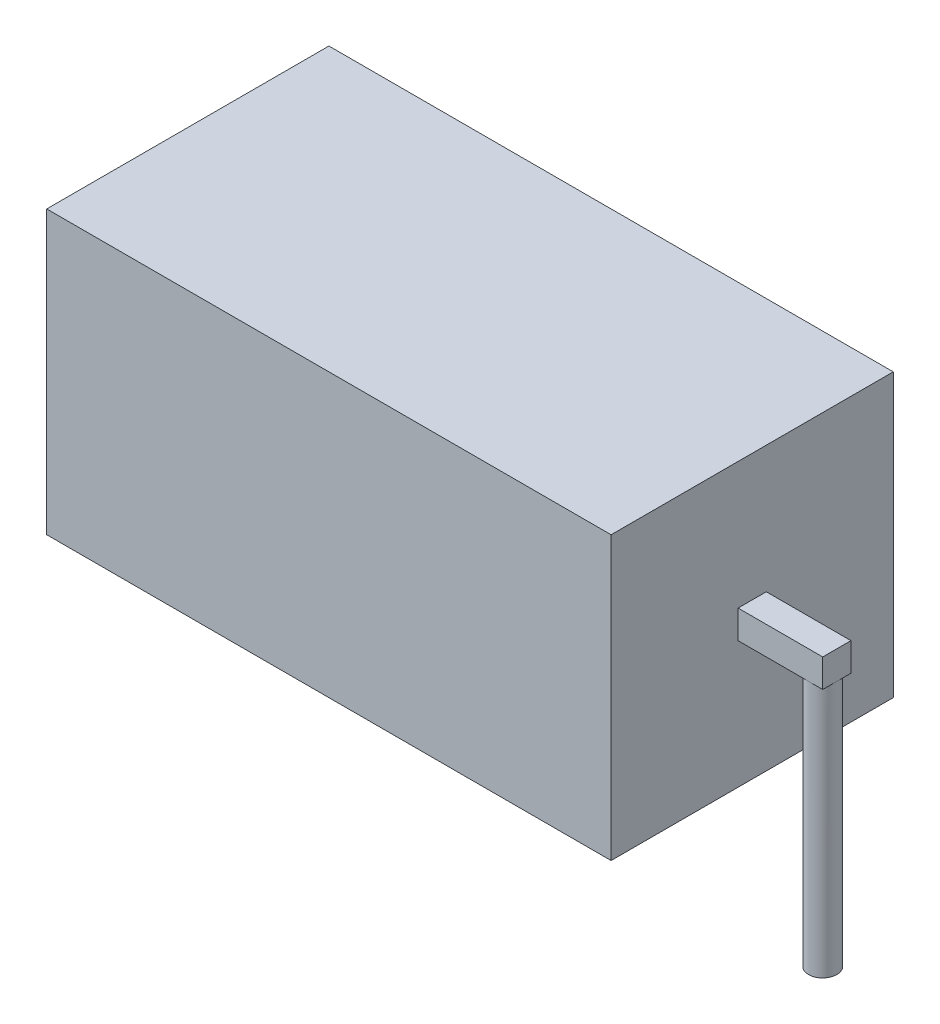
ISO-10303-21;
HEADER;
FILE_DESCRIPTION(('STEP AP214'),'2;1');
FILE_NAME('part.step','',(''),(''),'','','');
FILE_SCHEMA(('AUTOMOTIVE_DESIGN { 1 0 10303 214 1 1 1 1 }'));
ENDSEC;
DATA;
#1=APPLICATION_CONTEXT('core data for automotive mechanical design processes');
#2=APPLICATION_PROTOCOL_DEFINITION('international standard','automotive_design',2000,#1);
#3=PRODUCT_CONTEXT('',#1,'mechanical');
#4=PRODUCT('Part','Part','',(#3));
#5=PRODUCT_RELATED_PRODUCT_CATEGORY('part','',(#4));
#6=PRODUCT_DEFINITION_FORMATION('','',#4);
#7=PRODUCT_DEFINITION_CONTEXT('part definition',#1,'design');
#8=PRODUCT_DEFINITION('design','',#6,#7);
#9=PRODUCT_DEFINITION_SHAPE('','',#8);
#10=(LENGTH_UNIT() NAMED_UNIT(*) SI_UNIT(.MILLI.,.METRE.));
#11=(NAMED_UNIT(*) PLANE_ANGLE_UNIT() SI_UNIT($,.RADIAN.));
#12=(NAMED_UNIT(*) SI_UNIT($,.STERADIAN.) SOLID_ANGLE_UNIT());
#13=UNCERTAINTY_MEASURE_WITH_UNIT(LENGTH_MEASURE(1.E-05),#10,'distance_accuracy_value','');
#14=(GEOMETRIC_REPRESENTATION_CONTEXT(3) GLOBAL_UNCERTAINTY_ASSIGNED_CONTEXT((#13)) GLOBAL_UNIT_ASSIGNED_CONTEXT((#10,
#11,#12)) REPRESENTATION_CONTEXT('',''));
#15=CARTESIAN_POINT('',(0.,0.,0.));
#16=DIRECTION('',(0.,0.,1.));
#17=DIRECTION('',(1.,0.,0.));
#18=AXIS2_PLACEMENT_3D('',#15,#16,#17);
#19=CARTESIAN_POINT('',(23.,4.5,5.5));
#20=DIRECTION('',(0.,1.,0.));
#21=DIRECTION('',(0.,0.,1.));
#22=AXIS2_PLACEMENT_3D('',#19,#20,#21);
#23=PLANE('',#22);
#24=CARTESIAN_POINT('',(22.5,4.5,5.));
#25=DIRECTION('',(0.,-1.,0.));
#26=DIRECTION('',(0.,0.,-1.));
#27=AXIS2_PLACEMENT_3D('',#24,#25,#26);
#28=CIRCLE('',#27,0.499999999999999);
#29=CARTESIAN_POINT('',(22.5,4.5,5.5));
#30=VERTEX_POINT('',#29);
#31=CARTESIAN_POINT('',(22.5,4.5,4.5));
#32=VERTEX_POINT('',#31);
#33=EDGE_CURVE('E155',#30,#32,#28,.T.);
#34=ORIENTED_EDGE('',*,*,#33,.F.);
#35=DIRECTION('',(-1.,0.,0.));
#36=VECTOR('',#35,1.);
#37=CARTESIAN_POINT('',(23.,4.5,5.5));
#38=LINE('',#37,#36);
#39=CARTESIAN_POINT('',(20.,4.5,5.5));
#40=VERTEX_POINT('',#39);
#41=EDGE_CURVE('E144',#30,#40,#38,.T.);
#42=ORIENTED_EDGE('',*,*,#41,.T.);
#43=DIRECTION('',(0.,0.,-1.));
#44=VECTOR('',#43,1.);
#45=CARTESIAN_POINT('',(20.,4.5,10.));
#46=LINE('',#45,#44);
#47=CARTESIAN_POINT('',(20.,4.5,4.5));
#48=VERTEX_POINT('',#47);
#49=EDGE_CURVE('E37',#40,#48,#46,.T.);
#50=ORIENTED_EDGE('',*,*,#49,.T.);
#51=DIRECTION('',(-1.,0.,0.));
#52=VECTOR('',#51,1.);
#53=CARTESIAN_POINT('',(23.,4.5,4.5));
#54=LINE('',#53,#52);
#55=EDGE_CURVE('E156',#32,#48,#54,.T.);
#56=ORIENTED_EDGE('',*,*,#55,.F.);
#57=EDGE_LOOP('',(#34,#42,#50,#56));
#58=FACE_BOUND('',#57,.T.);
#59=ADVANCED_FACE('F29',(#58),#23,.F.);
#60=CARTESIAN_POINT('',(23.,4.5,5.));
#61=VERTEX_POINT('',#60);
#62=EDGE_CURVE('E51',#32,#61,#28,.T.);
#63=ORIENTED_EDGE('',*,*,#62,.F.);
#64=CARTESIAN_POINT('',(23.,4.5,4.5));
#65=VERTEX_POINT('',#64);
#66=EDGE_CURVE('E202',#65,#32,#54,.T.);
#67=ORIENTED_EDGE('',*,*,#66,.F.);
#68=DIRECTION('',(0.,0.,-1.));
#69=VECTOR('',#68,1.);
#70=CARTESIAN_POINT('',(23.,4.5,5.5));
#71=LINE('',#70,#69);
#72=EDGE_CURVE('E188',#61,#65,#71,.T.);
#73=ORIENTED_EDGE('',*,*,#72,.F.);
#74=EDGE_LOOP('',(#63,#67,#73));
#75=FACE_BOUND('',#74,.T.);
#76=ADVANCED_FACE('F264',(#75),#23,.F.);
#77=EDGE_CURVE('E44',#61,#30,#28,.T.);
#78=ORIENTED_EDGE('',*,*,#77,.F.);
#79=CARTESIAN_POINT('',(23.,4.5,5.5));
#80=VERTEX_POINT('',#79);
#81=EDGE_CURVE('E139',#80,#61,#71,.T.);
#82=ORIENTED_EDGE('',*,*,#81,.F.);
#83=EDGE_CURVE('E135',#80,#30,#38,.T.);
#84=ORIENTED_EDGE('',*,*,#83,.T.);
#85=EDGE_LOOP('',(#78,#82,#84));
#86=FACE_BOUND('',#85,.T.);
#87=ADVANCED_FACE('F137',(#86),#23,.F.);
#88=CARTESIAN_POINT('',(-2.5,4.5,5.));
#89=DIRECTION('',(0.,-1.,0.));
#90=DIRECTION('',(0.,0.,-1.));
#91=AXIS2_PLACEMENT_3D('',#88,#89,#90);
#92=CIRCLE('',#91,0.5);
#93=CARTESIAN_POINT('',(-2.5,4.5,5.5));
#94=VERTEX_POINT('',#93);
#95=CARTESIAN_POINT('',(-3.,4.5,5.));
#96=VERTEX_POINT('',#95);
#97=EDGE_CURVE('E170',#94,#96,#92,.T.);
#98=ORIENTED_EDGE('',*,*,#97,.F.);
#99=CARTESIAN_POINT('',(-3.,4.5,5.5));
#100=VERTEX_POINT('',#99);
#101=EDGE_CURVE('E153',#94,#100,#38,.T.);
#102=ORIENTED_EDGE('',*,*,#101,.T.);
#103=DIRECTION('',(0.,0.,-1.));
#104=VECTOR('',#103,1.);
#105=CARTESIAN_POINT('',(-3.,4.5,5.5));
#106=LINE('',#105,#104);
#107=EDGE_CURVE('E177',#100,#96,#106,.T.);
#108=ORIENTED_EDGE('',*,*,#107,.T.);
#109=EDGE_LOOP('',(#98,#102,#108));
#110=FACE_BOUND('',#109,.T.);
#111=ADVANCED_FACE('F271',(#110),#23,.F.);
#112=CARTESIAN_POINT('',(-2.5,4.5,4.5));
#113=VERTEX_POINT('',#112);
#114=EDGE_CURVE('E165',#96,#113,#92,.T.);
#115=ORIENTED_EDGE('',*,*,#114,.F.);
#116=CARTESIAN_POINT('',(-3.,4.5,4.5));
#117=VERTEX_POINT('',#116);
#118=EDGE_CURVE('E176',#96,#117,#106,.T.);
#119=ORIENTED_EDGE('',*,*,#118,.T.);
#120=EDGE_CURVE('E201',#113,#117,#54,.T.);
#121=ORIENTED_EDGE('',*,*,#120,.F.);
#122=EDGE_LOOP('',(#115,#119,#121));
#123=FACE_BOUND('',#122,.T.);
#124=ADVANCED_FACE('F272',(#123),#23,.F.);
#125=EDGE_CURVE('E166',#113,#94,#92,.T.);
#126=ORIENTED_EDGE('',*,*,#125,.F.);
#127=CARTESIAN_POINT('',(0.,4.5,4.5));
#128=VERTEX_POINT('',#127);
#129=EDGE_CURVE('E203',#128,#113,#54,.T.);
#130=ORIENTED_EDGE('',*,*,#129,.F.);
#131=DIRECTION('',(0.,0.,1.));
#132=VECTOR('',#131,1.);
#133=CARTESIAN_POINT('',(0.,4.5,10.));
#134=LINE('',#133,#132);
#135=CARTESIAN_POINT('',(0.,4.5,5.5));
#136=VERTEX_POINT('',#135);
#137=EDGE_CURVE('E210',#128,#136,#134,.T.);
#138=ORIENTED_EDGE('',*,*,#137,.T.);
#139=EDGE_CURVE('E146',#136,#94,#38,.T.);
#140=ORIENTED_EDGE('',*,*,#139,.T.);
#141=EDGE_LOOP('',(#126,#130,#138,#140));
#142=FACE_BOUND('',#141,.T.);
#143=ADVANCED_FACE('F277',(#142),#23,.F.);
#144=CARTESIAN_POINT('',(0.,0.,10.));
#145=DIRECTION('',(1.,0.,0.));
#146=DIRECTION('',(0.,0.,-1.));
#147=AXIS2_PLACEMENT_3D('',#144,#145,#146);
#148=PLANE('',#147);
#149=DIRECTION('',(0.,-1.,0.));
#150=VECTOR('',#149,1.);
#151=CARTESIAN_POINT('',(0.,0.,0.));
#152=LINE('',#151,#150);
#153=CARTESIAN_POINT('',(0.,10.,0.));
#154=VERTEX_POINT('',#153);
#155=CARTESIAN_POINT('',(0.,0.,0.));
#156=VERTEX_POINT('',#155);
#157=EDGE_CURVE('E216',#154,#156,#152,.T.);
#158=ORIENTED_EDGE('',*,*,#157,.T.);
#159=DIRECTION('',(0.,0.,-1.));
#160=VECTOR('',#159,1.);
#161=CARTESIAN_POINT('',(0.,0.,10.));
#162=LINE('',#161,#160);
#163=CARTESIAN_POINT('',(0.,0.,10.));
#164=VERTEX_POINT('',#163);
#165=EDGE_CURVE('E243',#164,#156,#162,.T.);
#166=ORIENTED_EDGE('',*,*,#165,.F.);
#167=DIRECTION('',(0.,-1.,0.));
#168=VECTOR('',#167,1.);
#169=CARTESIAN_POINT('',(0.,0.,10.));
#170=LINE('',#169,#168);
#171=CARTESIAN_POINT('',(0.,10.,10.));
#172=VERTEX_POINT('',#171);
#173=EDGE_CURVE('E225',#172,#164,#170,.T.);
#174=ORIENTED_EDGE('',*,*,#173,.F.);
#175=DIRECTION('',(0.,0.,-1.));
#176=VECTOR('',#175,1.);
#177=CARTESIAN_POINT('',(0.,10.,10.));
#178=LINE('',#177,#176);
#179=EDGE_CURVE('E234',#172,#154,#178,.T.);
#180=ORIENTED_EDGE('',*,*,#179,.T.);
#181=EDGE_LOOP('',(#158,#166,#174,#180));
#182=FACE_BOUND('',#181,.T.);
#183=DIRECTION('',(0.,1.,0.));
#184=VECTOR('',#183,1.);
#185=CARTESIAN_POINT('',(0.,0.,5.5));
#186=LINE('',#185,#184);
#187=CARTESIAN_POINT('',(0.,5.5,5.5));
#188=VERTEX_POINT('',#187);
#189=EDGE_CURVE('E213',#136,#188,#186,.T.);
#190=ORIENTED_EDGE('',*,*,#189,.F.);
#191=ORIENTED_EDGE('',*,*,#137,.F.);
#192=DIRECTION('',(0.,-1.,0.));
#193=VECTOR('',#192,1.);
#194=CARTESIAN_POINT('',(0.,0.,4.5));
#195=LINE('',#194,#193);
#196=CARTESIAN_POINT('',(0.,5.5,4.5));
#197=VERTEX_POINT('',#196);
#198=EDGE_CURVE('E207',#197,#128,#195,.T.);
#199=ORIENTED_EDGE('',*,*,#198,.F.);
#200=DIRECTION('',(0.,0.,-1.));
#201=VECTOR('',#200,1.);
#202=CARTESIAN_POINT('',(0.,5.5,10.));
#203=LINE('',#202,#201);
#204=EDGE_CURVE('E143',#188,#197,#203,.T.);
#205=ORIENTED_EDGE('',*,*,#204,.F.);
#206=EDGE_LOOP('',(#190,#191,#199,#205));
#207=FACE_BOUND('',#206,.T.);
#208=ADVANCED_FACE('F31',(#182,#207),#148,.F.);
#209=CARTESIAN_POINT('',(20.,0.,10.));
#210=DIRECTION('',(-1.,0.,0.));
#211=DIRECTION('',(0.,0.,1.));
#212=AXIS2_PLACEMENT_3D('',#209,#210,#211);
#213=PLANE('',#212);
#214=DIRECTION('',(0.,1.,0.));
#215=VECTOR('',#214,1.);
#216=CARTESIAN_POINT('',(20.,0.,0.));
#217=LINE('',#216,#215);
#218=CARTESIAN_POINT('',(20.,0.,0.));
#219=VERTEX_POINT('',#218);
#220=CARTESIAN_POINT('',(20.,10.,0.));
#221=VERTEX_POINT('',#220);
#222=EDGE_CURVE('E221',#219,#221,#217,.T.);
#223=ORIENTED_EDGE('',*,*,#222,.T.);
#224=DIRECTION('',(0.,0.,-1.));
#225=VECTOR('',#224,1.);
#226=CARTESIAN_POINT('',(20.,10.,10.));
#227=LINE('',#226,#225);
#228=CARTESIAN_POINT('',(20.,10.,10.));
#229=VERTEX_POINT('',#228);
#230=EDGE_CURVE('E237',#229,#221,#227,.T.);
#231=ORIENTED_EDGE('',*,*,#230,.F.);
#232=DIRECTION('',(0.,1.,0.));
#233=VECTOR('',#232,1.);
#234=CARTESIAN_POINT('',(20.,0.,10.));
#235=LINE('',#234,#233);
#236=CARTESIAN_POINT('',(20.,0.,10.));
#237=VERTEX_POINT('',#236);
#238=EDGE_CURVE('E230',#237,#229,#235,.T.);
#239=ORIENTED_EDGE('',*,*,#238,.F.);
#240=DIRECTION('',(0.,0.,-1.));
#241=VECTOR('',#240,1.);
#242=CARTESIAN_POINT('',(20.,0.,10.));
#243=LINE('',#242,#241);
#244=EDGE_CURVE('E240',#237,#219,#243,.T.);
#245=ORIENTED_EDGE('',*,*,#244,.T.);
#246=EDGE_LOOP('',(#223,#231,#239,#245));
#247=FACE_BOUND('',#246,.T.);
#248=DIRECTION('',(0.,-1.,0.));
#249=VECTOR('',#248,1.);
#250=CARTESIAN_POINT('',(20.,0.,5.5));
#251=LINE('',#250,#249);
#252=CARTESIAN_POINT('',(20.,5.5,5.5));
#253=VERTEX_POINT('',#252);
#254=EDGE_CURVE('E11',#253,#40,#251,.T.);
#255=ORIENTED_EDGE('',*,*,#254,.F.);
#256=DIRECTION('',(0.,0.,1.));
#257=VECTOR('',#256,1.);
#258=CARTESIAN_POINT('',(20.,5.5,10.));
#259=LINE('',#258,#257);
#260=CARTESIAN_POINT('',(20.,5.5,4.5));
#261=VERTEX_POINT('',#260);
#262=EDGE_CURVE('E246',#261,#253,#259,.T.);
#263=ORIENTED_EDGE('',*,*,#262,.F.);
#264=DIRECTION('',(0.,1.,0.));
#265=VECTOR('',#264,1.);
#266=CARTESIAN_POINT('',(20.,0.,4.5));
#267=LINE('',#266,#265);
#268=EDGE_CURVE('E249',#48,#261,#267,.T.);
#269=ORIENTED_EDGE('',*,*,#268,.F.);
#270=ORIENTED_EDGE('',*,*,#49,.F.);
#271=EDGE_LOOP('',(#255,#263,#269,#270));
#272=FACE_BOUND('',#271,.T.);
#273=ADVANCED_FACE('F253',(#247,#272),#213,.F.);
#274=CARTESIAN_POINT('',(0.,0.,10.));
#275=DIRECTION('',(0.,1.,0.));
#276=DIRECTION('',(0.,0.,1.));
#277=AXIS2_PLACEMENT_3D('',#274,#275,#276);
#278=PLANE('',#277);
#279=DIRECTION('',(1.,0.,0.));
#280=VECTOR('',#279,1.);
#281=CARTESIAN_POINT('',(0.,0.,0.));
#282=LINE('',#281,#280);
#283=EDGE_CURVE('E219',#156,#219,#282,.T.);
#284=ORIENTED_EDGE('',*,*,#283,.T.);
#285=ORIENTED_EDGE('',*,*,#244,.F.);
#286=DIRECTION('',(1.,0.,0.));
#287=VECTOR('',#286,1.);
#288=CARTESIAN_POINT('',(0.,0.,10.));
#289=LINE('',#288,#287);
#290=EDGE_CURVE('E228',#164,#237,#289,.T.);
#291=ORIENTED_EDGE('',*,*,#290,.F.);
#292=ORIENTED_EDGE('',*,*,#165,.T.);
#293=EDGE_LOOP('',(#284,#285,#291,#292));
#294=FACE_BOUND('',#293,.T.);
#295=ADVANCED_FACE('F295',(#294),#278,.F.);
#296=CARTESIAN_POINT('',(0.,10.,10.));
#297=DIRECTION('',(0.,-1.,0.));
#298=DIRECTION('',(0.,0.,-1.));
#299=AXIS2_PLACEMENT_3D('',#296,#297,#298);
#300=PLANE('',#299);
#301=DIRECTION('',(-1.,0.,0.));
#302=VECTOR('',#301,1.);
#303=CARTESIAN_POINT('',(0.,10.,0.));
#304=LINE('',#303,#302);
#305=EDGE_CURVE('E223',#221,#154,#304,.T.);
#306=ORIENTED_EDGE('',*,*,#305,.T.);
#307=ORIENTED_EDGE('',*,*,#179,.F.);
#308=DIRECTION('',(-1.,0.,0.));
#309=VECTOR('',#308,1.);
#310=CARTESIAN_POINT('',(0.,10.,10.));
#311=LINE('',#310,#309);
#312=EDGE_CURVE('E232',#229,#172,#311,.T.);
#313=ORIENTED_EDGE('',*,*,#312,.F.);
#314=ORIENTED_EDGE('',*,*,#230,.T.);
#315=EDGE_LOOP('',(#306,#307,#313,#314));
#316=FACE_BOUND('',#315,.T.);
#317=ADVANCED_FACE('F291',(#316),#300,.F.);
#318=CARTESIAN_POINT('',(0.,10.,10.));
#319=DIRECTION('',(0.,0.,-1.));
#320=DIRECTION('',(-1.,0.,0.));
#321=AXIS2_PLACEMENT_3D('',#318,#319,#320);
#322=PLANE('',#321);
#323=ORIENTED_EDGE('',*,*,#173,.T.);
#324=ORIENTED_EDGE('',*,*,#290,.T.);
#325=ORIENTED_EDGE('',*,*,#238,.T.);
#326=ORIENTED_EDGE('',*,*,#312,.T.);
#327=EDGE_LOOP('',(#323,#324,#325,#326));
#328=FACE_BOUND('',#327,.T.);
#329=ADVANCED_FACE('F287',(#328),#322,.F.);
#330=CARTESIAN_POINT('',(0.,10.,0.));
#331=DIRECTION('',(0.,0.,-1.));
#332=DIRECTION('',(-1.,0.,0.));
#333=AXIS2_PLACEMENT_3D('',#330,#331,#332);
#334=PLANE('',#333);
#335=ORIENTED_EDGE('',*,*,#157,.F.);
#336=ORIENTED_EDGE('',*,*,#305,.F.);
#337=ORIENTED_EDGE('',*,*,#222,.F.);
#338=ORIENTED_EDGE('',*,*,#283,.F.);
#339=EDGE_LOOP('',(#335,#336,#337,#338));
#340=FACE_BOUND('',#339,.T.);
#341=ADVANCED_FACE('F284',(#340),#334,.T.);
#342=CARTESIAN_POINT('',(23.,5.5,5.5));
#343=DIRECTION('',(-1.,0.,0.));
#344=DIRECTION('',(0.,0.,1.));
#345=AXIS2_PLACEMENT_3D('',#342,#343,#344);
#346=PLANE('',#345);
#347=DIRECTION('',(0.,-1.,0.));
#348=VECTOR('',#347,1.);
#349=CARTESIAN_POINT('',(23.,4.5,5.5));
#350=LINE('',#349,#348);
#351=CARTESIAN_POINT('',(23.,5.5,5.5));
#352=VERTEX_POINT('',#351);
#353=EDGE_CURVE('E186',#352,#80,#350,.T.);
#354=ORIENTED_EDGE('',*,*,#353,.T.);
#355=ORIENTED_EDGE('',*,*,#81,.T.);
#356=ORIENTED_EDGE('',*,*,#72,.T.);
#357=DIRECTION('',(0.,1.,0.));
#358=VECTOR('',#357,1.);
#359=CARTESIAN_POINT('',(23.,4.5,4.5));
#360=LINE('',#359,#358);
#361=CARTESIAN_POINT('',(23.,5.5,4.5));
#362=VERTEX_POINT('',#361);
#363=EDGE_CURVE('E190',#65,#362,#360,.T.);
#364=ORIENTED_EDGE('',*,*,#363,.T.);
#365=DIRECTION('',(0.,0.,1.));
#366=VECTOR('',#365,1.);
#367=CARTESIAN_POINT('',(23.,5.5,5.5));
#368=LINE('',#367,#366);
#369=EDGE_CURVE('E192',#362,#352,#368,.T.);
#370=ORIENTED_EDGE('',*,*,#369,.T.);
#371=EDGE_LOOP('',(#354,#355,#356,#364,#370));
#372=FACE_BOUND('',#371,.T.);
#373=ADVANCED_FACE('F263',(#372),#346,.F.);
#374=CARTESIAN_POINT('',(23.,5.5,5.5));
#375=DIRECTION('',(0.,-1.,0.));
#376=DIRECTION('',(0.,0.,-1.));
#377=AXIS2_PLACEMENT_3D('',#374,#375,#376);
#378=PLANE('',#377);
#379=DIRECTION('',(-1.,0.,0.));
#380=VECTOR('',#379,1.);
#381=CARTESIAN_POINT('',(23.,5.5,4.5));
#382=LINE('',#381,#380);
#383=EDGE_CURVE('E198',#362,#261,#382,.T.);
#384=ORIENTED_EDGE('',*,*,#383,.T.);
#385=ORIENTED_EDGE('',*,*,#262,.T.);
#386=DIRECTION('',(-1.,0.,0.));
#387=VECTOR('',#386,1.);
#388=CARTESIAN_POINT('',(23.,5.5,5.5));
#389=LINE('',#388,#387);
#390=EDGE_CURVE('E195',#352,#253,#389,.T.);
#391=ORIENTED_EDGE('',*,*,#390,.F.);
#392=ORIENTED_EDGE('',*,*,#369,.F.);
#393=EDGE_LOOP('',(#384,#385,#391,#392));
#394=FACE_BOUND('',#393,.T.);
#395=ADVANCED_FACE('F260',(#394),#378,.F.);
#396=CARTESIAN_POINT('',(23.,4.5,4.5));
#397=DIRECTION('',(0.,0.,1.));
#398=DIRECTION('',(1.,0.,0.));
#399=AXIS2_PLACEMENT_3D('',#396,#397,#398);
#400=PLANE('',#399);
#401=ORIENTED_EDGE('',*,*,#66,.T.);
#402=ORIENTED_EDGE('',*,*,#55,.T.);
#403=ORIENTED_EDGE('',*,*,#268,.T.);
#404=ORIENTED_EDGE('',*,*,#383,.F.);
#405=ORIENTED_EDGE('',*,*,#363,.F.);
#406=EDGE_LOOP('',(#401,#402,#403,#404,#405));
#407=FACE_BOUND('',#406,.T.);
#408=ADVANCED_FACE('F256',(#407),#400,.F.);
#409=CARTESIAN_POINT('',(23.,4.5,5.5));
#410=DIRECTION('',(0.,0.,-1.));
#411=DIRECTION('',(-1.,0.,0.));
#412=AXIS2_PLACEMENT_3D('',#409,#410,#411);
#413=PLANE('',#412);
#414=ORIENTED_EDGE('',*,*,#390,.T.);
#415=ORIENTED_EDGE('',*,*,#254,.T.);
#416=ORIENTED_EDGE('',*,*,#41,.F.);
#417=ORIENTED_EDGE('',*,*,#83,.F.);
#418=ORIENTED_EDGE('',*,*,#353,.F.);
#419=EDGE_LOOP('',(#414,#415,#416,#417,#418));
#420=FACE_BOUND('',#419,.T.);
#421=ADVANCED_FACE('F149',(#420),#413,.F.);
#422=ORIENTED_EDGE('',*,*,#139,.F.);
#423=ORIENTED_EDGE('',*,*,#189,.T.);
#424=CARTESIAN_POINT('',(-3.,5.5,5.5));
#425=VERTEX_POINT('',#424);
#426=EDGE_CURVE('E194',#188,#425,#389,.T.);
#427=ORIENTED_EDGE('',*,*,#426,.T.);
#428=DIRECTION('',(0.,-1.,0.));
#429=VECTOR('',#428,1.);
#430=CARTESIAN_POINT('',(-3.,4.5,5.5));
#431=LINE('',#430,#429);
#432=EDGE_CURVE('E173',#425,#100,#431,.T.);
#433=ORIENTED_EDGE('',*,*,#432,.T.);
#434=ORIENTED_EDGE('',*,*,#101,.F.);
#435=EDGE_LOOP('',(#422,#423,#427,#433,#434));
#436=FACE_BOUND('',#435,.T.);
#437=ADVANCED_FACE('F280',(#436),#413,.F.);
#438=CARTESIAN_POINT('',(-3.,5.5,4.5));
#439=VERTEX_POINT('',#438);
#440=EDGE_CURVE('E197',#197,#439,#382,.T.);
#441=ORIENTED_EDGE('',*,*,#440,.F.);
#442=ORIENTED_EDGE('',*,*,#198,.T.);
#443=ORIENTED_EDGE('',*,*,#129,.T.);
#444=ORIENTED_EDGE('',*,*,#120,.T.);
#445=DIRECTION('',(0.,1.,0.));
#446=VECTOR('',#445,1.);
#447=CARTESIAN_POINT('',(-3.,4.5,4.5));
#448=LINE('',#447,#446);
#449=EDGE_CURVE('E180',#117,#439,#448,.T.);
#450=ORIENTED_EDGE('',*,*,#449,.T.);
#451=EDGE_LOOP('',(#441,#442,#443,#444,#450));
#452=FACE_BOUND('',#451,.T.);
#453=ADVANCED_FACE('F278',(#452),#400,.F.);
#454=ORIENTED_EDGE('',*,*,#426,.F.);
#455=ORIENTED_EDGE('',*,*,#204,.T.);
#456=ORIENTED_EDGE('',*,*,#440,.T.);
#457=DIRECTION('',(0.,0.,1.));
#458=VECTOR('',#457,1.);
#459=CARTESIAN_POINT('',(-3.,5.5,5.5));
#460=LINE('',#459,#458);
#461=EDGE_CURVE('E183',#439,#425,#460,.T.);
#462=ORIENTED_EDGE('',*,*,#461,.T.);
#463=EDGE_LOOP('',(#454,#455,#456,#462));
#464=FACE_BOUND('',#463,.T.);
#465=ADVANCED_FACE('F333',(#464),#378,.F.);
#466=CARTESIAN_POINT('',(-3.,5.5,5.5));
#467=DIRECTION('',(-1.,0.,0.));
#468=DIRECTION('',(0.,0.,1.));
#469=AXIS2_PLACEMENT_3D('',#466,#467,#468);
#470=PLANE('',#469);
#471=ORIENTED_EDGE('',*,*,#432,.F.);
#472=ORIENTED_EDGE('',*,*,#461,.F.);
#473=ORIENTED_EDGE('',*,*,#449,.F.);
#474=ORIENTED_EDGE('',*,*,#118,.F.);
#475=ORIENTED_EDGE('',*,*,#107,.F.);
#476=EDGE_LOOP('',(#471,#472,#473,#474,#475));
#477=FACE_BOUND('',#476,.T.);
#478=ADVANCED_FACE('F328',(#477),#470,.T.);
#479=CARTESIAN_POINT('',(-2.5,-4.5,5.));
#480=DIRECTION('',(0.,1.,0.));
#481=DIRECTION('',(0.,0.,1.));
#482=AXIS2_PLACEMENT_3D('',#479,#480,#481);
#483=CYLINDRICAL_SURFACE('',#482,0.5);
#484=CARTESIAN_POINT('',(-2.5,-4.5,5.));
#485=DIRECTION('',(0.,-1.,0.));
#486=DIRECTION('',(0.,0.,-1.));
#487=AXIS2_PLACEMENT_3D('',#484,#485,#486);
#488=CIRCLE('',#487,0.5);
#489=CARTESIAN_POINT('',(-2.5,-4.5,4.5));
#490=VERTEX_POINT('',#489);
#491=EDGE_CURVE('E169',#490,#490,#488,.T.);
#492=ORIENTED_EDGE('',*,*,#491,.F.);
#493=EDGE_LOOP('',(#492));
#494=FACE_BOUND('',#493,.T.);
#495=ORIENTED_EDGE('',*,*,#125,.T.);
#496=ORIENTED_EDGE('',*,*,#97,.T.);
#497=ORIENTED_EDGE('',*,*,#114,.T.);
#498=EDGE_LOOP('',(#495,#496,#497));
#499=FACE_BOUND('',#498,.T.);
#500=ADVANCED_FACE('F340',(#494,#499),#483,.T.);
#501=CARTESIAN_POINT('',(-2.5,-4.5,5.));
#502=DIRECTION('',(0.,-1.,0.));
#503=DIRECTION('',(0.,0.,-1.));
#504=AXIS2_PLACEMENT_3D('',#501,#502,#503);
#505=PLANE('',#504);
#506=ORIENTED_EDGE('',*,*,#491,.T.);
#507=EDGE_LOOP('',(#506));
#508=FACE_BOUND('',#507,.T.);
#509=ADVANCED_FACE('F342',(#508),#505,.T.);
#510=CARTESIAN_POINT('',(22.5,-4.5,5.));
#511=DIRECTION('',(0.,1.,0.));
#512=DIRECTION('',(0.,0.,1.));
#513=AXIS2_PLACEMENT_3D('',#510,#511,#512);
#514=CYLINDRICAL_SURFACE('',#513,0.499999999999999);
#515=CARTESIAN_POINT('',(22.5,-4.5,5.));
#516=DIRECTION('',(0.,-1.,0.));
#517=DIRECTION('',(0.,0.,-1.));
#518=AXIS2_PLACEMENT_3D('',#515,#516,#517);
#519=CIRCLE('',#518,0.499999999999999);
#520=CARTESIAN_POINT('',(22.5,-4.5,4.5));
#521=VERTEX_POINT('',#520);
#522=EDGE_CURVE('E161',#521,#521,#519,.T.);
#523=ORIENTED_EDGE('',*,*,#522,.F.);
#524=EDGE_LOOP('',(#523));
#525=FACE_BOUND('',#524,.T.);
#526=ORIENTED_EDGE('',*,*,#62,.T.);
#527=ORIENTED_EDGE('',*,*,#77,.T.);
#528=ORIENTED_EDGE('',*,*,#33,.T.);
#529=EDGE_LOOP('',(#526,#527,#528));
#530=FACE_BOUND('',#529,.T.);
#531=ADVANCED_FACE('F160',(#525,#530),#514,.T.);
#532=CARTESIAN_POINT('',(22.5,-4.5,5.));
#533=DIRECTION('',(0.,-1.,0.));
#534=DIRECTION('',(0.,0.,-1.));
#535=AXIS2_PLACEMENT_3D('',#532,#533,#534);
#536=PLANE('',#535);
#537=ORIENTED_EDGE('',*,*,#522,.T.);
#538=EDGE_LOOP('',(#537));
#539=FACE_BOUND('',#538,.T.);
#540=ADVANCED_FACE('F405',(#539),#536,.T.);
#541=CLOSED_SHELL('',(#59,#76,#87,#111,#124,#143,#208,#273,#295,#317,#329,#341,#373,#395,#408,
#421,#437,#453,#465,#478,#500,#509,#531,#540));
#542=MANIFOLD_SOLID_BREP('B2',#541);
#543=ADVANCED_BREP_SHAPE_REPRESENTATION('',(#18,#542),#14);
#544=SHAPE_DEFINITION_REPRESENTATION(#9,#543);
ENDSEC;
END-ISO-10303-21;
